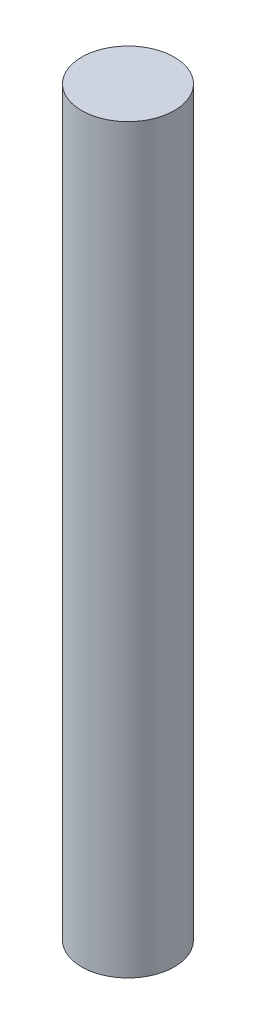
ISO-10303-21;
HEADER;
FILE_DESCRIPTION(('STEP AP214'),'2;1');
FILE_NAME('part.step','',(''),(''),'','','');
FILE_SCHEMA(('AUTOMOTIVE_DESIGN { 1 0 10303 214 1 1 1 1 }'));
ENDSEC;
DATA;
#1=APPLICATION_CONTEXT('core data for automotive mechanical design processes');
#2=APPLICATION_PROTOCOL_DEFINITION('international standard','automotive_design',2000,#1);
#3=PRODUCT_CONTEXT('',#1,'mechanical');
#4=PRODUCT('Part','Part','',(#3));
#5=PRODUCT_RELATED_PRODUCT_CATEGORY('part','',(#4));
#6=PRODUCT_DEFINITION_FORMATION('','',#4);
#7=PRODUCT_DEFINITION_CONTEXT('part definition',#1,'design');
#8=PRODUCT_DEFINITION('design','',#6,#7);
#9=PRODUCT_DEFINITION_SHAPE('','',#8);
#10=(LENGTH_UNIT() NAMED_UNIT(*) SI_UNIT(.MILLI.,.METRE.));
#11=(NAMED_UNIT(*) PLANE_ANGLE_UNIT() SI_UNIT($,.RADIAN.));
#12=(NAMED_UNIT(*) SI_UNIT($,.STERADIAN.) SOLID_ANGLE_UNIT());
#13=UNCERTAINTY_MEASURE_WITH_UNIT(LENGTH_MEASURE(1.E-05),#10,'distance_accuracy_value','');
#14=(GEOMETRIC_REPRESENTATION_CONTEXT(3) GLOBAL_UNCERTAINTY_ASSIGNED_CONTEXT((#13)) GLOBAL_UNIT_ASSIGNED_CONTEXT((#10,
#11,#12)) REPRESENTATION_CONTEXT('',''));
#15=CARTESIAN_POINT('',(0.,0.,0.));
#16=DIRECTION('',(0.,0.,1.));
#17=DIRECTION('',(1.,0.,0.));
#18=AXIS2_PLACEMENT_3D('',#15,#16,#17);
#19=CARTESIAN_POINT('',(0.,2.,0.));
#20=DIRECTION('',(0.,-1.,0.));
#21=DIRECTION('',(0.,0.,-1.));
#22=AXIS2_PLACEMENT_3D('',#19,#20,#21);
#23=CYLINDRICAL_SURFACE('',#22,0.125);
#24=CARTESIAN_POINT('',(0.,2.,0.));
#25=DIRECTION('',(0.,1.,0.));
#26=DIRECTION('',(0.,0.,1.));
#27=AXIS2_PLACEMENT_3D('',#24,#25,#26);
#28=CIRCLE('',#27,0.125);
#29=CARTESIAN_POINT('',(0.,2.,0.125));
#30=VERTEX_POINT('',#29);
#31=EDGE_CURVE('E10',#30,#30,#28,.T.);
#32=ORIENTED_EDGE('',*,*,#31,.F.);
#33=EDGE_LOOP('',(#32));
#34=FACE_BOUND('',#33,.T.);
#35=CARTESIAN_POINT('',(0.,0.,0.));
#36=DIRECTION('',(0.,1.,0.));
#37=DIRECTION('',(0.,0.,1.));
#38=AXIS2_PLACEMENT_3D('',#35,#36,#37);
#39=CIRCLE('',#38,0.125);
#40=CARTESIAN_POINT('',(0.,0.,0.125));
#41=VERTEX_POINT('',#40);
#42=EDGE_CURVE('E34',#41,#41,#39,.T.);
#43=ORIENTED_EDGE('',*,*,#42,.T.);
#44=EDGE_LOOP('',(#43));
#45=FACE_BOUND('',#44,.T.);
#46=ADVANCED_FACE('F31',(#34,#45),#23,.T.);
#47=CARTESIAN_POINT('',(0.,2.,0.));
#48=DIRECTION('',(0.,1.,0.));
#49=DIRECTION('',(0.,0.,1.));
#50=AXIS2_PLACEMENT_3D('',#47,#48,#49);
#51=PLANE('',#50);
#52=ORIENTED_EDGE('',*,*,#31,.T.);
#53=EDGE_LOOP('',(#52));
#54=FACE_BOUND('',#53,.T.);
#55=ADVANCED_FACE('F46',(#54),#51,.T.);
#56=CARTESIAN_POINT('',(0.,0.,0.));
#57=DIRECTION('',(0.,1.,0.));
#58=DIRECTION('',(0.,0.,1.));
#59=AXIS2_PLACEMENT_3D('',#56,#57,#58);
#60=PLANE('',#59);
#61=ORIENTED_EDGE('',*,*,#42,.F.);
#62=EDGE_LOOP('',(#61));
#63=FACE_BOUND('',#62,.T.);
#64=ADVANCED_FACE('F44',(#63),#60,.F.);
#65=CLOSED_SHELL('',(#46,#55,#64));
#66=MANIFOLD_SOLID_BREP('B2',#65);
#67=ADVANCED_BREP_SHAPE_REPRESENTATION('',(#18,#66),#14);
#68=SHAPE_DEFINITION_REPRESENTATION(#9,#67);
ENDSEC;
END-ISO-10303-21;
